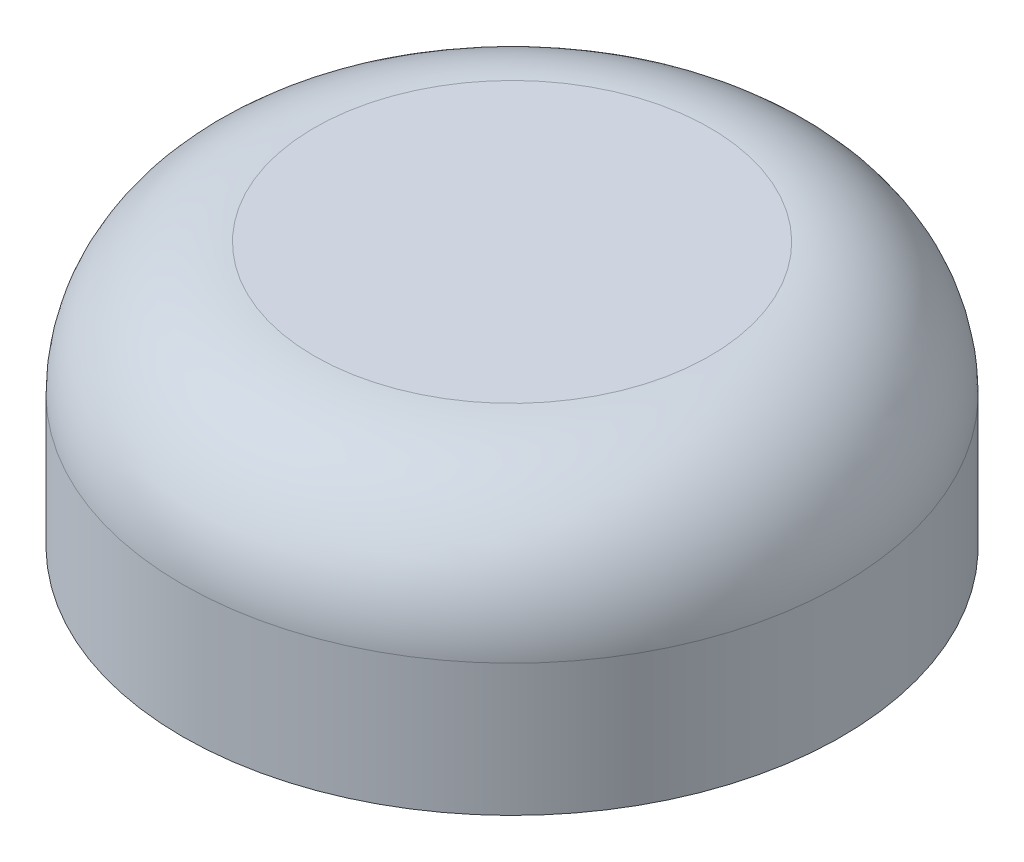
ISO-10303-21;
HEADER;
FILE_DESCRIPTION(('STEP AP214'),'2;1');
FILE_NAME('part.step','',(''),(''),'','','');
FILE_SCHEMA(('AUTOMOTIVE_DESIGN { 1 0 10303 214 1 1 1 1 }'));
ENDSEC;
DATA;
#1=APPLICATION_CONTEXT('core data for automotive mechanical design processes');
#2=APPLICATION_PROTOCOL_DEFINITION('international standard','automotive_design',2000,#1);
#3=PRODUCT_CONTEXT('',#1,'mechanical');
#4=PRODUCT('Part','Part','',(#3));
#5=PRODUCT_RELATED_PRODUCT_CATEGORY('part','',(#4));
#6=PRODUCT_DEFINITION_FORMATION('','',#4);
#7=PRODUCT_DEFINITION_CONTEXT('part definition',#1,'design');
#8=PRODUCT_DEFINITION('design','',#6,#7);
#9=PRODUCT_DEFINITION_SHAPE('','',#8);
#10=(LENGTH_UNIT() NAMED_UNIT(*) SI_UNIT(.MILLI.,.METRE.));
#11=(NAMED_UNIT(*) PLANE_ANGLE_UNIT() SI_UNIT($,.RADIAN.));
#12=(NAMED_UNIT(*) SI_UNIT($,.STERADIAN.) SOLID_ANGLE_UNIT());
#13=UNCERTAINTY_MEASURE_WITH_UNIT(LENGTH_MEASURE(1.E-05),#10,'distance_accuracy_value','');
#14=(GEOMETRIC_REPRESENTATION_CONTEXT(3) GLOBAL_UNCERTAINTY_ASSIGNED_CONTEXT((#13)) GLOBAL_UNIT_ASSIGNED_CONTEXT((#10,
#11,#12)) REPRESENTATION_CONTEXT('',''));
#15=CARTESIAN_POINT('',(0.,0.,0.));
#16=DIRECTION('',(0.,0.,1.));
#17=DIRECTION('',(1.,0.,0.));
#18=AXIS2_PLACEMENT_3D('',#15,#16,#17);
#19=CARTESIAN_POINT('',(0.,2.,0.));
#20=DIRECTION('',(0.,-1.,0.));
#21=DIRECTION('',(0.,0.,-1.));
#22=AXIS2_PLACEMENT_3D('',#19,#20,#21);
#23=CYLINDRICAL_SURFACE('',#22,2.5);
#24=CARTESIAN_POINT('',(0.,1.,0.));
#25=DIRECTION('',(0.,1.,0.));
#26=DIRECTION('',(0.,0.,1.));
#27=AXIS2_PLACEMENT_3D('',#24,#25,#26);
#28=CIRCLE('',#27,2.5);
#29=CARTESIAN_POINT('',(0.,1.,2.5));
#30=VERTEX_POINT('',#29);
#31=EDGE_CURVE('E10',#30,#30,#28,.F.);
#32=ORIENTED_EDGE('',*,*,#31,.T.);
#33=EDGE_LOOP('',(#32));
#34=FACE_BOUND('',#33,.T.);
#35=CARTESIAN_POINT('',(0.,0.,0.));
#36=DIRECTION('',(0.,1.,0.));
#37=DIRECTION('',(0.,0.,1.));
#38=AXIS2_PLACEMENT_3D('',#35,#36,#37);
#39=CIRCLE('',#38,2.5);
#40=CARTESIAN_POINT('',(0.,0.,2.5));
#41=VERTEX_POINT('',#40);
#42=EDGE_CURVE('E50',#41,#41,#39,.T.);
#43=ORIENTED_EDGE('',*,*,#42,.T.);
#44=EDGE_LOOP('',(#43));
#45=FACE_BOUND('',#44,.T.);
#46=ADVANCED_FACE('F37',(#34,#45),#23,.T.);
#47=CARTESIAN_POINT('',(0.,2.,0.));
#48=DIRECTION('',(0.,1.,0.));
#49=DIRECTION('',(0.,0.,1.));
#50=AXIS2_PLACEMENT_3D('',#47,#48,#49);
#51=PLANE('',#50);
#52=CARTESIAN_POINT('',(0.,2.,0.));
#53=DIRECTION('',(0.,1.,0.));
#54=DIRECTION('',(0.,0.,1.));
#55=AXIS2_PLACEMENT_3D('',#52,#53,#54);
#56=CIRCLE('',#55,1.5);
#57=CARTESIAN_POINT('',(0.,2.,1.5));
#58=VERTEX_POINT('',#57);
#59=EDGE_CURVE('E45',#58,#58,#56,.T.);
#60=ORIENTED_EDGE('',*,*,#59,.T.);
#61=EDGE_LOOP('',(#60));
#62=FACE_BOUND('',#61,.T.);
#63=ADVANCED_FACE('F77',(#62),#51,.T.);
#64=CARTESIAN_POINT('',(0.,0.,0.));
#65=DIRECTION('',(0.,1.,0.));
#66=DIRECTION('',(0.,0.,1.));
#67=AXIS2_PLACEMENT_3D('',#64,#65,#66);
#68=PLANE('',#67);
#69=CARTESIAN_POINT('',(0.,0.,0.));
#70=DIRECTION('',(0.,-1.,0.));
#71=DIRECTION('',(0.,0.,-1.));
#72=AXIS2_PLACEMENT_3D('',#69,#70,#71);
#73=CIRCLE('',#72,1.5);
#74=CARTESIAN_POINT('',(0.,0.,-1.5));
#75=VERTEX_POINT('',#74);
#76=EDGE_CURVE('E58',#75,#75,#73,.T.);
#77=ORIENTED_EDGE('',*,*,#76,.F.);
#78=EDGE_LOOP('',(#77));
#79=FACE_BOUND('',#78,.T.);
#80=ORIENTED_EDGE('',*,*,#42,.F.);
#81=EDGE_LOOP('',(#80));
#82=FACE_BOUND('',#81,.T.);
#83=ADVANCED_FACE('F74',(#79,#82),#68,.F.);
#84=CARTESIAN_POINT('',(0.,1.,0.));
#85=DIRECTION('',(0.,1.,0.));
#86=DIRECTION('',(0.,0.,1.));
#87=AXIS2_PLACEMENT_3D('',#84,#85,#86);
#88=TOROIDAL_SURFACE('',#87,1.5,1.);
#89=ORIENTED_EDGE('',*,*,#31,.F.);
#90=EDGE_LOOP('',(#89));
#91=FACE_BOUND('',#90,.T.);
#92=ORIENTED_EDGE('',*,*,#59,.F.);
#93=EDGE_LOOP('',(#92));
#94=FACE_BOUND('',#93,.T.);
#95=ADVANCED_FACE('F39',(#91,#94),#88,.T.);
#96=CARTESIAN_POINT('',(0.,1.,0.));
#97=DIRECTION('',(0.,-1.,0.));
#98=DIRECTION('',(0.,0.,-1.));
#99=AXIS2_PLACEMENT_3D('',#96,#97,#98);
#100=CYLINDRICAL_SURFACE('',#99,1.5);
#101=CARTESIAN_POINT('',(0.,1.,0.));
#102=DIRECTION('',(0.,-1.,0.));
#103=DIRECTION('',(0.,0.,-1.));
#104=AXIS2_PLACEMENT_3D('',#101,#102,#103);
#105=CIRCLE('',#104,1.5);
#106=CARTESIAN_POINT('',(0.,1.,-1.5));
#107=VERTEX_POINT('',#106);
#108=EDGE_CURVE('E55',#107,#107,#105,.T.);
#109=ORIENTED_EDGE('',*,*,#108,.F.);
#110=EDGE_LOOP('',(#109));
#111=FACE_BOUND('',#110,.T.);
#112=ORIENTED_EDGE('',*,*,#76,.T.);
#113=EDGE_LOOP('',(#112));
#114=FACE_BOUND('',#113,.T.);
#115=ADVANCED_FACE('F68',(#111,#114),#100,.F.);
#116=CARTESIAN_POINT('',(0.,1.,0.));
#117=DIRECTION('',(0.,-1.,0.));
#118=DIRECTION('',(0.,0.,-1.));
#119=AXIS2_PLACEMENT_3D('',#116,#117,#118);
#120=PLANE('',#119);
#121=ORIENTED_EDGE('',*,*,#108,.T.);
#122=EDGE_LOOP('',(#121));
#123=FACE_BOUND('',#122,.T.);
#124=ADVANCED_FACE('F66',(#123),#120,.T.);
#125=CLOSED_SHELL('',(#46,#63,#83,#95,#115,#124));
#126=MANIFOLD_SOLID_BREP('B2',#125);
#127=ADVANCED_BREP_SHAPE_REPRESENTATION('',(#18,#126),#14);
#128=SHAPE_DEFINITION_REPRESENTATION(#9,#127);
ENDSEC;
END-ISO-10303-21;
